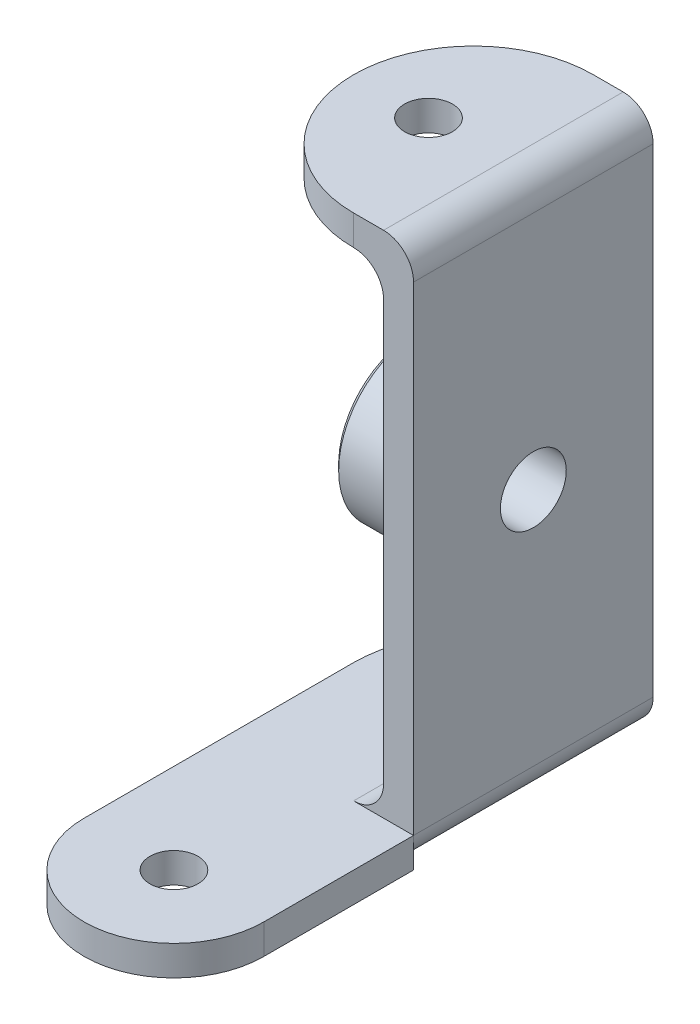
ISO-10303-21;
HEADER;
FILE_DESCRIPTION(('STEP AP214'),'2;1');
FILE_NAME('part.step','',(''),(''),'','','');
FILE_SCHEMA(('AUTOMOTIVE_DESIGN { 1 0 10303 214 1 1 1 1 }'));
ENDSEC;
DATA;
#1=APPLICATION_CONTEXT('core data for automotive mechanical design processes');
#2=APPLICATION_PROTOCOL_DEFINITION('international standard','automotive_design',2000,#1);
#3=PRODUCT_CONTEXT('',#1,'mechanical');
#4=PRODUCT('Part','Part','',(#3));
#5=PRODUCT_RELATED_PRODUCT_CATEGORY('part','',(#4));
#6=PRODUCT_DEFINITION_FORMATION('','',#4);
#7=PRODUCT_DEFINITION_CONTEXT('part definition',#1,'design');
#8=PRODUCT_DEFINITION('design','',#6,#7);
#9=PRODUCT_DEFINITION_SHAPE('','',#8);
#10=(LENGTH_UNIT() NAMED_UNIT(*) SI_UNIT(.MILLI.,.METRE.));
#11=(NAMED_UNIT(*) PLANE_ANGLE_UNIT() SI_UNIT($,.RADIAN.));
#12=(NAMED_UNIT(*) SI_UNIT($,.STERADIAN.) SOLID_ANGLE_UNIT());
#13=UNCERTAINTY_MEASURE_WITH_UNIT(LENGTH_MEASURE(1.E-05),#10,'distance_accuracy_value','');
#14=(GEOMETRIC_REPRESENTATION_CONTEXT(3) GLOBAL_UNCERTAINTY_ASSIGNED_CONTEXT((#13)) GLOBAL_UNIT_ASSIGNED_CONTEXT((#10,
#11,#12)) REPRESENTATION_CONTEXT('',''));
#15=CARTESIAN_POINT('',(0.,0.,0.));
#16=DIRECTION('',(0.,0.,1.));
#17=DIRECTION('',(1.,0.,0.));
#18=AXIS2_PLACEMENT_3D('',#15,#16,#17);
#19=CARTESIAN_POINT('',(30.,0.,0.));
#20=DIRECTION('',(-1.,0.,0.));
#21=DIRECTION('',(0.,-1.,0.));
#22=AXIS2_PLACEMENT_3D('',#19,#20,#21);
#23=CYLINDRICAL_SURFACE('',#22,5.5);
#24=CARTESIAN_POINT('',(30.,0.,0.));
#25=DIRECTION('',(-1.,0.,0.));
#26=DIRECTION('',(0.,-1.,0.));
#27=AXIS2_PLACEMENT_3D('',#24,#25,#26);
#28=CIRCLE('',#27,5.5);
#29=CARTESIAN_POINT('',(30.,-5.5,0.));
#30=VERTEX_POINT('',#29);
#31=EDGE_CURVE('E200',#30,#30,#28,.T.);
#32=ORIENTED_EDGE('',*,*,#31,.F.);
#33=EDGE_LOOP('',(#32));
#34=FACE_BOUND('',#33,.T.);
#35=CARTESIAN_POINT('',(15.,0.,0.));
#36=DIRECTION('',(-1.,0.,0.));
#37=DIRECTION('',(0.,-1.,0.));
#38=AXIS2_PLACEMENT_3D('',#35,#36,#37);
#39=CIRCLE('',#38,5.5);
#40=CARTESIAN_POINT('',(15.,-5.5,0.));
#41=VERTEX_POINT('',#40);
#42=EDGE_CURVE('E50',#41,#41,#39,.F.);
#43=ORIENTED_EDGE('',*,*,#42,.F.);
#44=EDGE_LOOP('',(#43));
#45=FACE_BOUND('',#44,.T.);
#46=ADVANCED_FACE('F45',(#34,#45),#23,.F.);
#47=CARTESIAN_POINT('',(15.,-40.,45.));
#48=DIRECTION('',(0.,1.,0.));
#49=DIRECTION('',(0.,0.,1.));
#50=AXIS2_PLACEMENT_3D('',#47,#48,#49);
#51=CYLINDRICAL_SURFACE('',#50,15.);
#52=DIRECTION('',(0.,-1.,0.));
#53=VECTOR('',#52,1.);
#54=CARTESIAN_POINT('',(30.,-40.,45.));
#55=LINE('',#54,#53);
#56=CARTESIAN_POINT('',(30.,-40.,45.));
#57=VERTEX_POINT('',#56);
#58=CARTESIAN_POINT('',(30.,-45.,45.));
#59=VERTEX_POINT('',#58);
#60=EDGE_CURVE('E147',#57,#59,#55,.T.);
#61=ORIENTED_EDGE('',*,*,#60,.F.);
#62=CARTESIAN_POINT('',(15.,-40.,45.));
#63=DIRECTION('',(0.,-1.,0.));
#64=DIRECTION('',(1.,0.,0.));
#65=AXIS2_PLACEMENT_3D('',#62,#63,#64);
#66=CIRCLE('',#65,15.);
#67=CARTESIAN_POINT('',(0.,-40.,45.));
#68=VERTEX_POINT('',#67);
#69=EDGE_CURVE('E56',#68,#57,#66,.F.);
#70=ORIENTED_EDGE('',*,*,#69,.F.);
#71=DIRECTION('',(0.,1.,0.));
#72=VECTOR('',#71,1.);
#73=CARTESIAN_POINT('',(0.,-40.,45.));
#74=LINE('',#73,#72);
#75=CARTESIAN_POINT('',(0.,-45.,45.));
#76=VERTEX_POINT('',#75);
#77=EDGE_CURVE('E328',#76,#68,#74,.T.);
#78=ORIENTED_EDGE('',*,*,#77,.F.);
#79=CARTESIAN_POINT('',(15.,-45.,45.));
#80=DIRECTION('',(0.,1.,0.));
#81=DIRECTION('',(0.,0.,1.));
#82=AXIS2_PLACEMENT_3D('',#79,#80,#81);
#83=CIRCLE('',#82,15.);
#84=EDGE_CURVE('E11',#59,#76,#83,.F.);
#85=ORIENTED_EDGE('',*,*,#84,.F.);
#86=EDGE_LOOP('',(#61,#70,#78,#85));
#87=FACE_BOUND('',#86,.T.);
#88=ADVANCED_FACE('F48',(#87),#51,.T.);
#89=CARTESIAN_POINT('',(20.,-45.,0.));
#90=DIRECTION('',(0.,-1.,0.));
#91=DIRECTION('',(1.,0.,0.));
#92=AXIS2_PLACEMENT_3D('',#89,#90,#91);
#93=CYLINDRICAL_SURFACE('',#92,20.);
#94=CARTESIAN_POINT('',(20.,-45.,0.));
#95=DIRECTION('',(0.,1.,0.));
#96=DIRECTION('',(0.,0.,1.));
#97=AXIS2_PLACEMENT_3D('',#94,#95,#96);
#98=CIRCLE('',#97,20.);
#99=CARTESIAN_POINT('',(0.,-45.,0.));
#100=VERTEX_POINT('',#99);
#101=CARTESIAN_POINT('',(20.,-45.,-20.));
#102=VERTEX_POINT('',#101);
#103=EDGE_CURVE('E312',#100,#102,#98,.F.);
#104=ORIENTED_EDGE('',*,*,#103,.F.);
#105=DIRECTION('',(0.,-1.,0.));
#106=VECTOR('',#105,1.);
#107=CARTESIAN_POINT('',(0.,-45.,0.));
#108=LINE('',#107,#106);
#109=CARTESIAN_POINT('',(0.,-40.,0.));
#110=VERTEX_POINT('',#109);
#111=EDGE_CURVE('E176',#110,#100,#108,.T.);
#112=ORIENTED_EDGE('',*,*,#111,.F.);
#113=CARTESIAN_POINT('',(20.,-40.,0.));
#114=DIRECTION('',(0.,-1.,0.));
#115=DIRECTION('',(1.,0.,0.));
#116=AXIS2_PLACEMENT_3D('',#113,#114,#115);
#117=CIRCLE('',#116,20.);
#118=CARTESIAN_POINT('',(20.,-40.,-20.));
#119=VERTEX_POINT('',#118);
#120=EDGE_CURVE('E315',#119,#110,#117,.F.);
#121=ORIENTED_EDGE('',*,*,#120,.F.);
#122=DIRECTION('',(0.,1.,0.));
#123=VECTOR('',#122,1.);
#124=CARTESIAN_POINT('',(20.,-45.,-20.));
#125=LINE('',#124,#123);
#126=EDGE_CURVE('E308',#102,#119,#125,.T.);
#127=ORIENTED_EDGE('',*,*,#126,.F.);
#128=EDGE_LOOP('',(#104,#112,#121,#127));
#129=FACE_BOUND('',#128,.T.);
#130=ADVANCED_FACE('F342',(#129),#93,.T.);
#131=CARTESIAN_POINT('',(20.,45.,0.));
#132=DIRECTION('',(0.,-1.,0.));
#133=DIRECTION('',(1.,0.,0.));
#134=AXIS2_PLACEMENT_3D('',#131,#132,#133);
#135=CYLINDRICAL_SURFACE('',#134,20.);
#136=DIRECTION('',(0.,-1.,0.));
#137=VECTOR('',#136,1.);
#138=CARTESIAN_POINT('',(20.,35.,20.));
#139=LINE('',#138,#137);
#140=CARTESIAN_POINT('',(20.,45.,20.));
#141=VERTEX_POINT('',#140);
#142=CARTESIAN_POINT('',(20.,40.,20.));
#143=VERTEX_POINT('',#142);
#144=EDGE_CURVE('E294',#141,#143,#139,.T.);
#145=ORIENTED_EDGE('',*,*,#144,.F.);
#146=CARTESIAN_POINT('',(20.,45.,0.));
#147=DIRECTION('',(0.,-1.,0.));
#148=DIRECTION('',(0.,0.,-1.));
#149=AXIS2_PLACEMENT_3D('',#146,#147,#148);
#150=CIRCLE('',#149,20.);
#151=CARTESIAN_POINT('',(20.,45.,-20.));
#152=VERTEX_POINT('',#151);
#153=EDGE_CURVE('E302',#152,#141,#150,.F.);
#154=ORIENTED_EDGE('',*,*,#153,.F.);
#155=DIRECTION('',(0.,1.,0.));
#156=VECTOR('',#155,1.);
#157=CARTESIAN_POINT('',(20.,45.,-20.));
#158=LINE('',#157,#156);
#159=CARTESIAN_POINT('',(20.,40.,-20.));
#160=VERTEX_POINT('',#159);
#161=EDGE_CURVE('E298',#160,#152,#158,.T.);
#162=ORIENTED_EDGE('',*,*,#161,.F.);
#163=CARTESIAN_POINT('',(20.,40.,0.));
#164=DIRECTION('',(0.,1.,0.));
#165=DIRECTION('',(0.,0.,1.));
#166=AXIS2_PLACEMENT_3D('',#163,#164,#165);
#167=CIRCLE('',#166,20.);
#168=EDGE_CURVE('E305',#143,#160,#167,.F.);
#169=ORIENTED_EDGE('',*,*,#168,.F.);
#170=EDGE_LOOP('',(#145,#154,#162,#169));
#171=FACE_BOUND('',#170,.T.);
#172=ADVANCED_FACE('F380',(#171),#135,.T.);
#173=CARTESIAN_POINT('',(0.,40.,20.));
#174=DIRECTION('',(0.,1.,0.));
#175=DIRECTION('',(0.,0.,1.));
#176=AXIS2_PLACEMENT_3D('',#173,#174,#175);
#177=PLANE('',#176);
#178=CARTESIAN_POINT('',(12.5,40.,0.));
#179=DIRECTION('',(0.,1.,0.));
#180=DIRECTION('',(0.,0.,1.));
#181=AXIS2_PLACEMENT_3D('',#178,#179,#180);
#182=CIRCLE('',#181,4.);
#183=CARTESIAN_POINT('',(12.5,40.,4.));
#184=VERTEX_POINT('',#183);
#185=EDGE_CURVE('E196',#184,#184,#182,.T.);
#186=ORIENTED_EDGE('',*,*,#185,.T.);
#187=EDGE_LOOP('',(#186));
#188=FACE_BOUND('',#187,.T.);
#189=DIRECTION('',(0.,0.,-1.));
#190=VECTOR('',#189,1.);
#191=CARTESIAN_POINT('',(20.,40.,20.));
#192=LINE('',#191,#190);
#193=EDGE_CURVE('E278',#143,#160,#192,.T.);
#194=ORIENTED_EDGE('',*,*,#193,.F.);
#195=ORIENTED_EDGE('',*,*,#168,.T.);
#196=EDGE_LOOP('',(#194,#195));
#197=FACE_BOUND('',#196,.T.);
#198=ADVANCED_FACE('F376',(#188,#197),#177,.F.);
#199=CARTESIAN_POINT('',(20.,35.,20.));
#200=DIRECTION('',(0.,0.,-1.));
#201=DIRECTION('',(-1.,0.,0.));
#202=AXIS2_PLACEMENT_3D('',#199,#200,#201);
#203=CYLINDRICAL_SURFACE('',#202,5.);
#204=CARTESIAN_POINT('',(20.,35.,-20.));
#205=DIRECTION('',(0.,0.,-1.));
#206=DIRECTION('',(-1.,0.,0.));
#207=AXIS2_PLACEMENT_3D('',#204,#205,#206);
#208=CIRCLE('',#207,5.);
#209=CARTESIAN_POINT('',(25.,35.,-20.));
#210=VERTEX_POINT('',#209);
#211=EDGE_CURVE('E204',#160,#210,#208,.T.);
#212=ORIENTED_EDGE('',*,*,#211,.T.);
#213=DIRECTION('',(0.,0.,-1.));
#214=VECTOR('',#213,1.);
#215=CARTESIAN_POINT('',(25.,35.,20.));
#216=LINE('',#215,#214);
#217=CARTESIAN_POINT('',(25.,35.,20.));
#218=VERTEX_POINT('',#217);
#219=EDGE_CURVE('E274',#218,#210,#216,.T.);
#220=ORIENTED_EDGE('',*,*,#219,.F.);
#221=CARTESIAN_POINT('',(20.,35.,20.));
#222=DIRECTION('',(0.,0.,-1.));
#223=DIRECTION('',(-1.,0.,0.));
#224=AXIS2_PLACEMENT_3D('',#221,#222,#223);
#225=CIRCLE('',#224,5.);
#226=EDGE_CURVE('E205',#143,#218,#225,.T.);
#227=ORIENTED_EDGE('',*,*,#226,.F.);
#228=ORIENTED_EDGE('',*,*,#193,.T.);
#229=EDGE_LOOP('',(#212,#220,#227,#228));
#230=FACE_BOUND('',#229,.T.);
#231=ADVANCED_FACE('F373',(#230),#203,.F.);
#232=CARTESIAN_POINT('',(25.,35.,20.));
#233=DIRECTION('',(1.,0.,0.));
#234=DIRECTION('',(0.,0.,-1.));
#235=AXIS2_PLACEMENT_3D('',#232,#233,#234);
#236=PLANE('',#235);
#237=CARTESIAN_POINT('',(25.,0.,0.));
#238=DIRECTION('',(1.,0.,0.));
#239=DIRECTION('',(0.,0.,-1.));
#240=AXIS2_PLACEMENT_3D('',#237,#238,#239);
#241=CIRCLE('',#240,13.5);
#242=CARTESIAN_POINT('',(25.,0.,-13.5));
#243=VERTEX_POINT('',#242);
#244=EDGE_CURVE('E282',#243,#243,#241,.F.);
#245=ORIENTED_EDGE('',*,*,#244,.F.);
#246=EDGE_LOOP('',(#245));
#247=FACE_BOUND('',#246,.T.);
#248=DIRECTION('',(0.,-1.,0.));
#249=VECTOR('',#248,1.);
#250=CARTESIAN_POINT('',(25.,35.,-20.));
#251=LINE('',#250,#249);
#252=CARTESIAN_POINT('',(25.,-35.,-20.));
#253=VERTEX_POINT('',#252);
#254=EDGE_CURVE('E231',#210,#253,#251,.T.);
#255=ORIENTED_EDGE('',*,*,#254,.T.);
#256=DIRECTION('',(0.,0.,-1.));
#257=VECTOR('',#256,1.);
#258=CARTESIAN_POINT('',(25.,-35.,20.));
#259=LINE('',#258,#257);
#260=CARTESIAN_POINT('',(25.,-35.,20.));
#261=VERTEX_POINT('',#260);
#262=EDGE_CURVE('E270',#261,#253,#259,.T.);
#263=ORIENTED_EDGE('',*,*,#262,.F.);
#264=DIRECTION('',(0.,-1.,0.));
#265=VECTOR('',#264,1.);
#266=CARTESIAN_POINT('',(25.,35.,20.));
#267=LINE('',#266,#265);
#268=EDGE_CURVE('E208',#218,#261,#267,.T.);
#269=ORIENTED_EDGE('',*,*,#268,.F.);
#270=ORIENTED_EDGE('',*,*,#219,.T.);
#271=EDGE_LOOP('',(#255,#263,#269,#270));
#272=FACE_BOUND('',#271,.T.);
#273=ADVANCED_FACE('F368',(#247,#272),#236,.F.);
#274=CARTESIAN_POINT('',(20.,-35.,20.));
#275=DIRECTION('',(0.,0.,-1.));
#276=DIRECTION('',(-1.,0.,0.));
#277=AXIS2_PLACEMENT_3D('',#274,#275,#276);
#278=CYLINDRICAL_SURFACE('',#277,5.);
#279=CARTESIAN_POINT('',(20.,-35.,-20.));
#280=DIRECTION('',(0.,0.,-1.));
#281=DIRECTION('',(-1.,0.,0.));
#282=AXIS2_PLACEMENT_3D('',#279,#280,#281);
#283=CIRCLE('',#282,5.);
#284=EDGE_CURVE('E234',#253,#119,#283,.T.);
#285=ORIENTED_EDGE('',*,*,#284,.T.);
#286=DIRECTION('',(0.,0.,-1.));
#287=VECTOR('',#286,1.);
#288=CARTESIAN_POINT('',(20.,-40.,20.));
#289=LINE('',#288,#287);
#290=CARTESIAN_POINT('',(20.,-40.,20.));
#291=VERTEX_POINT('',#290);
#292=EDGE_CURVE('E266',#291,#119,#289,.T.);
#293=ORIENTED_EDGE('',*,*,#292,.F.);
#294=CARTESIAN_POINT('',(20.,-35.,20.));
#295=DIRECTION('',(0.,0.,-1.));
#296=DIRECTION('',(-1.,0.,0.));
#297=AXIS2_PLACEMENT_3D('',#294,#295,#296);
#298=CIRCLE('',#297,5.);
#299=EDGE_CURVE('E212',#261,#291,#298,.T.);
#300=ORIENTED_EDGE('',*,*,#299,.F.);
#301=ORIENTED_EDGE('',*,*,#262,.T.);
#302=EDGE_LOOP('',(#285,#293,#300,#301));
#303=FACE_BOUND('',#302,.T.);
#304=ADVANCED_FACE('F363',(#303),#278,.F.);
#305=CARTESIAN_POINT('',(20.,-40.,20.));
#306=DIRECTION('',(0.,-1.,0.));
#307=DIRECTION('',(1.,0.,0.));
#308=AXIS2_PLACEMENT_3D('',#305,#306,#307);
#309=PLANE('',#308);
#310=CARTESIAN_POINT('',(15.,-40.,45.));
#311=DIRECTION('',(0.,1.,0.));
#312=DIRECTION('',(-1.,0.,0.));
#313=AXIS2_PLACEMENT_3D('',#310,#311,#312);
#314=CIRCLE('',#313,3.99999999999999);
#315=CARTESIAN_POINT('',(11.,-40.,45.));
#316=VERTEX_POINT('',#315);
#317=EDGE_CURVE('E325',#316,#316,#314,.T.);
#318=ORIENTED_EDGE('',*,*,#317,.F.);
#319=EDGE_LOOP('',(#318));
#320=FACE_BOUND('',#319,.T.);
#321=CARTESIAN_POINT('',(12.5,-40.,0.));
#322=DIRECTION('',(0.,1.,0.));
#323=DIRECTION('',(-1.,0.,0.));
#324=AXIS2_PLACEMENT_3D('',#321,#322,#323);
#325=CIRCLE('',#324,4.00000000000001);
#326=CARTESIAN_POINT('',(8.50000000000001,-40.,0.));
#327=VERTEX_POINT('',#326);
#328=EDGE_CURVE('E180',#327,#327,#325,.T.);
#329=ORIENTED_EDGE('',*,*,#328,.F.);
#330=EDGE_LOOP('',(#329));
#331=FACE_BOUND('',#330,.T.);
#332=DIRECTION('',(0.,0.,1.));
#333=VECTOR('',#332,1.);
#334=CARTESIAN_POINT('',(0.,-40.,-20.001));
#335=LINE('',#334,#333);
#336=EDGE_CURVE('E149',#110,#68,#335,.T.);
#337=ORIENTED_EDGE('',*,*,#336,.T.);
#338=ORIENTED_EDGE('',*,*,#69,.T.);
#339=DIRECTION('',(0.,0.,-1.));
#340=VECTOR('',#339,1.);
#341=CARTESIAN_POINT('',(30.,-40.,60.));
#342=LINE('',#341,#340);
#343=CARTESIAN_POINT('',(30.,-40.,20.));
#344=VERTEX_POINT('',#343);
#345=EDGE_CURVE('E150',#57,#344,#342,.T.);
#346=ORIENTED_EDGE('',*,*,#345,.T.);
#347=DIRECTION('',(-1.,0.,0.));
#348=VECTOR('',#347,1.);
#349=CARTESIAN_POINT('',(20.,-40.,20.));
#350=LINE('',#349,#348);
#351=EDGE_CURVE('E167',#344,#291,#350,.T.);
#352=ORIENTED_EDGE('',*,*,#351,.T.);
#353=ORIENTED_EDGE('',*,*,#292,.T.);
#354=ORIENTED_EDGE('',*,*,#120,.T.);
#355=EDGE_LOOP('',(#337,#338,#346,#352,#353,#354));
#356=FACE_BOUND('',#355,.T.);
#357=ADVANCED_FACE('F334',(#320,#331,#356),#309,.F.);
#358=CARTESIAN_POINT('',(25.,-45.,20.));
#359=DIRECTION('',(0.,1.,0.));
#360=DIRECTION('',(0.,0.,1.));
#361=AXIS2_PLACEMENT_3D('',#358,#359,#360);
#362=PLANE('',#361);
#363=CARTESIAN_POINT('',(15.,-45.,45.));
#364=DIRECTION('',(0.,1.,0.));
#365=DIRECTION('',(0.,0.,1.));
#366=AXIS2_PLACEMENT_3D('',#363,#364,#365);
#367=CIRCLE('',#366,3.99999999999999);
#368=CARTESIAN_POINT('',(15.,-45.,49.));
#369=VERTEX_POINT('',#368);
#370=EDGE_CURVE('E161',#369,#369,#367,.T.);
#371=ORIENTED_EDGE('',*,*,#370,.T.);
#372=EDGE_LOOP('',(#371));
#373=FACE_BOUND('',#372,.T.);
#374=DIRECTION('',(0.,0.,-1.));
#375=VECTOR('',#374,1.);
#376=CARTESIAN_POINT('',(30.,-45.,60.));
#377=LINE('',#376,#375);
#378=CARTESIAN_POINT('',(30.,-45.,20.));
#379=VERTEX_POINT('',#378);
#380=EDGE_CURVE('E140',#59,#379,#377,.T.);
#381=ORIENTED_EDGE('',*,*,#380,.F.);
#382=ORIENTED_EDGE('',*,*,#84,.T.);
#383=DIRECTION('',(0.,0.,1.));
#384=VECTOR('',#383,1.);
#385=CARTESIAN_POINT('',(0.,-45.,-20.001));
#386=LINE('',#385,#384);
#387=EDGE_CURVE('E181',#100,#76,#386,.T.);
#388=ORIENTED_EDGE('',*,*,#387,.F.);
#389=ORIENTED_EDGE('',*,*,#103,.T.);
#390=DIRECTION('',(1.,0.,0.));
#391=VECTOR('',#390,1.);
#392=CARTESIAN_POINT('',(25.,-45.,-20.));
#393=LINE('',#392,#391);
#394=CARTESIAN_POINT('',(25.,-45.,-20.));
#395=VERTEX_POINT('',#394);
#396=EDGE_CURVE('E238',#102,#395,#393,.T.);
#397=ORIENTED_EDGE('',*,*,#396,.T.);
#398=DIRECTION('',(0.,0.,-1.));
#399=VECTOR('',#398,1.);
#400=CARTESIAN_POINT('',(25.,-45.,20.));
#401=LINE('',#400,#399);
#402=CARTESIAN_POINT('',(25.,-45.,20.));
#403=VERTEX_POINT('',#402);
#404=EDGE_CURVE('E157',#403,#395,#401,.T.);
#405=ORIENTED_EDGE('',*,*,#404,.F.);
#406=DIRECTION('',(1.,0.,0.));
#407=VECTOR('',#406,1.);
#408=CARTESIAN_POINT('',(0.,-45.,20.));
#409=LINE('',#408,#407);
#410=EDGE_CURVE('E153',#403,#379,#409,.T.);
#411=ORIENTED_EDGE('',*,*,#410,.T.);
#412=EDGE_LOOP('',(#381,#382,#388,#389,#397,#405,#411));
#413=FACE_BOUND('',#412,.T.);
#414=CARTESIAN_POINT('',(12.5,-45.,0.));
#415=DIRECTION('',(0.,1.,0.));
#416=DIRECTION('',(0.,0.,1.));
#417=AXIS2_PLACEMENT_3D('',#414,#415,#416);
#418=CIRCLE('',#417,4.00000000000001);
#419=CARTESIAN_POINT('',(12.5,-45.,4.00000000000001));
#420=VERTEX_POINT('',#419);
#421=EDGE_CURVE('E191',#420,#420,#418,.T.);
#422=ORIENTED_EDGE('',*,*,#421,.T.);
#423=EDGE_LOOP('',(#422));
#424=FACE_BOUND('',#423,.T.);
#425=ADVANCED_FACE('F154',(#373,#413,#424),#362,.F.);
#426=CARTESIAN_POINT('',(25.,-40.,20.));
#427=DIRECTION('',(0.,0.,-1.));
#428=DIRECTION('',(-1.,0.,0.));
#429=AXIS2_PLACEMENT_3D('',#426,#427,#428);
#430=CYLINDRICAL_SURFACE('',#429,5.);
#431=CARTESIAN_POINT('',(25.,-40.,-20.));
#432=DIRECTION('',(0.,0.,1.));
#433=DIRECTION('',(-1.,0.,0.));
#434=AXIS2_PLACEMENT_3D('',#431,#432,#433);
#435=CIRCLE('',#434,5.);
#436=CARTESIAN_POINT('',(30.,-40.,-20.));
#437=VERTEX_POINT('',#436);
#438=EDGE_CURVE('E241',#395,#437,#435,.T.);
#439=ORIENTED_EDGE('',*,*,#438,.T.);
#440=DIRECTION('',(0.,0.,-1.));
#441=VECTOR('',#440,1.);
#442=CARTESIAN_POINT('',(30.,-40.,20.));
#443=LINE('',#442,#441);
#444=EDGE_CURVE('E260',#344,#437,#443,.T.);
#445=ORIENTED_EDGE('',*,*,#444,.F.);
#446=CARTESIAN_POINT('',(25.,-40.,20.));
#447=DIRECTION('',(0.,0.,1.));
#448=DIRECTION('',(-1.,0.,0.));
#449=AXIS2_PLACEMENT_3D('',#446,#447,#448);
#450=CIRCLE('',#449,5.);
#451=EDGE_CURVE('E164',#403,#344,#450,.T.);
#452=ORIENTED_EDGE('',*,*,#451,.F.);
#453=ORIENTED_EDGE('',*,*,#404,.T.);
#454=EDGE_LOOP('',(#439,#445,#452,#453));
#455=FACE_BOUND('',#454,.T.);
#456=ADVANCED_FACE('F351',(#455),#430,.T.);
#457=CARTESIAN_POINT('',(30.,40.,20.));
#458=DIRECTION('',(-1.,0.,0.));
#459=DIRECTION('',(0.,0.,1.));
#460=AXIS2_PLACEMENT_3D('',#457,#458,#459);
#461=PLANE('',#460);
#462=ORIENTED_EDGE('',*,*,#31,.T.);
#463=EDGE_LOOP('',(#462));
#464=FACE_BOUND('',#463,.T.);
#465=DIRECTION('',(0.,1.,0.));
#466=VECTOR('',#465,1.);
#467=CARTESIAN_POINT('',(30.,40.,-20.));
#468=LINE('',#467,#466);
#469=CARTESIAN_POINT('',(30.,40.,-20.));
#470=VERTEX_POINT('',#469);
#471=EDGE_CURVE('E244',#437,#470,#468,.T.);
#472=ORIENTED_EDGE('',*,*,#471,.T.);
#473=DIRECTION('',(0.,0.,-1.));
#474=VECTOR('',#473,1.);
#475=CARTESIAN_POINT('',(30.,40.,20.));
#476=LINE('',#475,#474);
#477=CARTESIAN_POINT('',(30.,40.,20.));
#478=VERTEX_POINT('',#477);
#479=EDGE_CURVE('E256',#478,#470,#476,.T.);
#480=ORIENTED_EDGE('',*,*,#479,.F.);
#481=DIRECTION('',(0.,1.,0.));
#482=VECTOR('',#481,1.);
#483=CARTESIAN_POINT('',(30.,40.,20.));
#484=LINE('',#483,#482);
#485=EDGE_CURVE('E218',#344,#478,#484,.T.);
#486=ORIENTED_EDGE('',*,*,#485,.F.);
#487=ORIENTED_EDGE('',*,*,#444,.T.);
#488=EDGE_LOOP('',(#472,#480,#486,#487));
#489=FACE_BOUND('',#488,.T.);
#490=ADVANCED_FACE('F354',(#464,#489),#461,.F.);
#491=CARTESIAN_POINT('',(25.,40.,20.));
#492=DIRECTION('',(0.,0.,-1.));
#493=DIRECTION('',(-1.,0.,0.));
#494=AXIS2_PLACEMENT_3D('',#491,#492,#493);
#495=CYLINDRICAL_SURFACE('',#494,5.);
#496=CARTESIAN_POINT('',(25.,40.,-20.));
#497=DIRECTION('',(0.,0.,1.));
#498=DIRECTION('',(-1.,0.,0.));
#499=AXIS2_PLACEMENT_3D('',#496,#497,#498);
#500=CIRCLE('',#499,5.);
#501=CARTESIAN_POINT('',(25.,45.,-20.));
#502=VERTEX_POINT('',#501);
#503=EDGE_CURVE('E247',#470,#502,#500,.T.);
#504=ORIENTED_EDGE('',*,*,#503,.T.);
#505=DIRECTION('',(0.,0.,-1.));
#506=VECTOR('',#505,1.);
#507=CARTESIAN_POINT('',(25.,45.,20.));
#508=LINE('',#507,#506);
#509=CARTESIAN_POINT('',(25.,45.,20.));
#510=VERTEX_POINT('',#509);
#511=EDGE_CURVE('E228',#510,#502,#508,.T.);
#512=ORIENTED_EDGE('',*,*,#511,.F.);
#513=CARTESIAN_POINT('',(25.,40.,20.));
#514=DIRECTION('',(0.,0.,1.));
#515=DIRECTION('',(-1.,0.,0.));
#516=AXIS2_PLACEMENT_3D('',#513,#514,#515);
#517=CIRCLE('',#516,5.);
#518=EDGE_CURVE('E221',#478,#510,#517,.T.);
#519=ORIENTED_EDGE('',*,*,#518,.F.);
#520=ORIENTED_EDGE('',*,*,#479,.T.);
#521=EDGE_LOOP('',(#504,#512,#519,#520));
#522=FACE_BOUND('',#521,.T.);
#523=ADVANCED_FACE('F386',(#522),#495,.T.);
#524=CARTESIAN_POINT('',(0.,45.,20.));
#525=DIRECTION('',(0.,-1.,0.));
#526=DIRECTION('',(0.,0.,-1.));
#527=AXIS2_PLACEMENT_3D('',#524,#525,#526);
#528=PLANE('',#527);
#529=CARTESIAN_POINT('',(12.5,45.,0.));
#530=DIRECTION('',(0.,1.,0.));
#531=DIRECTION('',(-1.,0.,0.));
#532=AXIS2_PLACEMENT_3D('',#529,#530,#531);
#533=CIRCLE('',#532,4.);
#534=CARTESIAN_POINT('',(8.49999999999999,45.,0.));
#535=VERTEX_POINT('',#534);
#536=EDGE_CURVE('E192',#535,#535,#533,.T.);
#537=ORIENTED_EDGE('',*,*,#536,.F.);
#538=EDGE_LOOP('',(#537));
#539=FACE_BOUND('',#538,.T.);
#540=DIRECTION('',(-1.,0.,0.));
#541=VECTOR('',#540,1.);
#542=CARTESIAN_POINT('',(0.,45.,-20.));
#543=LINE('',#542,#541);
#544=EDGE_CURVE('E209',#502,#152,#543,.T.);
#545=ORIENTED_EDGE('',*,*,#544,.T.);
#546=ORIENTED_EDGE('',*,*,#153,.T.);
#547=DIRECTION('',(-1.,0.,0.));
#548=VECTOR('',#547,1.);
#549=CARTESIAN_POINT('',(0.,45.,20.));
#550=LINE('',#549,#548);
#551=EDGE_CURVE('E224',#510,#141,#550,.T.);
#552=ORIENTED_EDGE('',*,*,#551,.F.);
#553=ORIENTED_EDGE('',*,*,#511,.T.);
#554=EDGE_LOOP('',(#545,#546,#552,#553));
#555=FACE_BOUND('',#554,.T.);
#556=ADVANCED_FACE('F383',(#539,#555),#528,.F.);
#557=CARTESIAN_POINT('',(20.,35.,20.));
#558=DIRECTION('',(0.,0.,-1.));
#559=DIRECTION('',(-1.,0.,0.));
#560=AXIS2_PLACEMENT_3D('',#557,#558,#559);
#561=PLANE('',#560);
#562=ORIENTED_EDGE('',*,*,#299,.T.);
#563=ORIENTED_EDGE('',*,*,#351,.F.);
#564=ORIENTED_EDGE('',*,*,#485,.T.);
#565=ORIENTED_EDGE('',*,*,#518,.T.);
#566=ORIENTED_EDGE('',*,*,#551,.T.);
#567=ORIENTED_EDGE('',*,*,#144,.T.);
#568=ORIENTED_EDGE('',*,*,#226,.T.);
#569=ORIENTED_EDGE('',*,*,#268,.T.);
#570=EDGE_LOOP('',(#562,#563,#564,#565,#566,#567,#568,#569));
#571=FACE_BOUND('',#570,.T.);
#572=ADVANCED_FACE('F358',(#571),#561,.F.);
#573=CARTESIAN_POINT('',(20.,35.,-20.));
#574=DIRECTION('',(0.,0.,-1.));
#575=DIRECTION('',(-1.,0.,0.));
#576=AXIS2_PLACEMENT_3D('',#573,#574,#575);
#577=PLANE('',#576);
#578=ORIENTED_EDGE('',*,*,#396,.F.);
#579=ORIENTED_EDGE('',*,*,#126,.T.);
#580=ORIENTED_EDGE('',*,*,#284,.F.);
#581=ORIENTED_EDGE('',*,*,#254,.F.);
#582=ORIENTED_EDGE('',*,*,#211,.F.);
#583=ORIENTED_EDGE('',*,*,#161,.T.);
#584=ORIENTED_EDGE('',*,*,#544,.F.);
#585=ORIENTED_EDGE('',*,*,#503,.F.);
#586=ORIENTED_EDGE('',*,*,#471,.F.);
#587=ORIENTED_EDGE('',*,*,#438,.F.);
#588=EDGE_LOOP('',(#578,#579,#580,#581,#582,#583,#584,#585,#586,#587));
#589=FACE_BOUND('',#588,.T.);
#590=ADVANCED_FACE('F346',(#589),#577,.T.);
#591=CARTESIAN_POINT('',(9.99999999999999,0.,0.));
#592=DIRECTION('',(1.,0.,0.));
#593=DIRECTION('',(0.,1.,0.));
#594=AXIS2_PLACEMENT_3D('',#591,#592,#593);
#595=CYLINDRICAL_SURFACE('',#594,13.5);
#596=CARTESIAN_POINT('',(11.,0.,0.));
#597=DIRECTION('',(-1.,0.,0.));
#598=DIRECTION('',(0.,-1.,0.));
#599=AXIS2_PLACEMENT_3D('',#596,#597,#598);
#600=CIRCLE('',#599,13.5);
#601=CARTESIAN_POINT('',(11.,-13.5,0.));
#602=VERTEX_POINT('',#601);
#603=EDGE_CURVE('E290',#602,#602,#600,.F.);
#604=ORIENTED_EDGE('',*,*,#603,.T.);
#605=EDGE_LOOP('',(#604));
#606=FACE_BOUND('',#605,.T.);
#607=ORIENTED_EDGE('',*,*,#244,.T.);
#608=EDGE_LOOP('',(#607));
#609=FACE_BOUND('',#608,.T.);
#610=ADVANCED_FACE('F413',(#606,#609),#595,.T.);
#611=CARTESIAN_POINT('',(9.99999999999999,0.,0.));
#612=DIRECTION('',(-1.,0.,0.));
#613=DIRECTION('',(0.,-1.,0.));
#614=AXIS2_PLACEMENT_3D('',#611,#612,#613);
#615=PLANE('',#614);
#616=CARTESIAN_POINT('',(9.99999999999999,0.,0.));
#617=DIRECTION('',(-1.,0.,0.));
#618=DIRECTION('',(0.,-1.,0.));
#619=AXIS2_PLACEMENT_3D('',#616,#617,#618);
#620=CIRCLE('',#619,10.);
#621=CARTESIAN_POINT('',(10.,-10.,0.));
#622=VERTEX_POINT('',#621);
#623=EDGE_CURVE('E659',#622,#622,#620,.T.);
#624=ORIENTED_EDGE('',*,*,#623,.F.);
#625=EDGE_LOOP('',(#624));
#626=FACE_BOUND('',#625,.T.);
#627=CARTESIAN_POINT('',(9.99999999999999,0.,0.));
#628=DIRECTION('',(-1.,0.,0.));
#629=DIRECTION('',(0.,-1.,0.));
#630=AXIS2_PLACEMENT_3D('',#627,#628,#629);
#631=CIRCLE('',#630,12.5);
#632=CARTESIAN_POINT('',(10.,-12.5,0.));
#633=VERTEX_POINT('',#632);
#634=EDGE_CURVE('E286',#633,#633,#631,.T.);
#635=ORIENTED_EDGE('',*,*,#634,.T.);
#636=EDGE_LOOP('',(#635));
#637=FACE_BOUND('',#636,.T.);
#638=ADVANCED_FACE('F409',(#626,#637),#615,.T.);
#639=CARTESIAN_POINT('',(9.99999999999999,0.,0.));
#640=DIRECTION('',(1.,0.,0.));
#641=DIRECTION('',(0.,1.,0.));
#642=AXIS2_PLACEMENT_3D('',#639,#640,#641);
#643=CONICAL_SURFACE('',#642,12.5,0.785398163397439);
#644=ORIENTED_EDGE('',*,*,#603,.F.);
#645=EDGE_LOOP('',(#644));
#646=FACE_BOUND('',#645,.T.);
#647=ORIENTED_EDGE('',*,*,#634,.F.);
#648=EDGE_LOOP('',(#647));
#649=FACE_BOUND('',#648,.T.);
#650=ADVANCED_FACE('F412',(#646,#649),#643,.T.);
#651=CARTESIAN_POINT('',(12.5,35.,0.));
#652=DIRECTION('',(0.,1.,0.));
#653=DIRECTION('',(-1.,0.,0.));
#654=AXIS2_PLACEMENT_3D('',#651,#652,#653);
#655=CYLINDRICAL_SURFACE('',#654,4.);
#656=ORIENTED_EDGE('',*,*,#536,.T.);
#657=EDGE_LOOP('',(#656));
#658=FACE_BOUND('',#657,.T.);
#659=ORIENTED_EDGE('',*,*,#185,.F.);
#660=EDGE_LOOP('',(#659));
#661=FACE_BOUND('',#660,.T.);
#662=ADVANCED_FACE('F407',(#658,#661),#655,.F.);
#663=CARTESIAN_POINT('',(12.5,-50.,0.));
#664=DIRECTION('',(0.,1.,0.));
#665=DIRECTION('',(-1.,0.,0.));
#666=AXIS2_PLACEMENT_3D('',#663,#664,#665);
#667=CYLINDRICAL_SURFACE('',#666,4.00000000000001);
#668=ORIENTED_EDGE('',*,*,#328,.T.);
#669=EDGE_LOOP('',(#668));
#670=FACE_BOUND('',#669,.T.);
#671=ORIENTED_EDGE('',*,*,#421,.F.);
#672=EDGE_LOOP('',(#671));
#673=FACE_BOUND('',#672,.T.);
#674=ADVANCED_FACE('F450',(#670,#673),#667,.F.);
#675=CARTESIAN_POINT('',(0.,-40.,-20.001));
#676=DIRECTION('',(-1.,0.,0.));
#677=DIRECTION('',(0.,0.,1.));
#678=AXIS2_PLACEMENT_3D('',#675,#676,#677);
#679=PLANE('',#678);
#680=ORIENTED_EDGE('',*,*,#387,.T.);
#681=ORIENTED_EDGE('',*,*,#77,.T.);
#682=ORIENTED_EDGE('',*,*,#336,.F.);
#683=ORIENTED_EDGE('',*,*,#111,.T.);
#684=EDGE_LOOP('',(#680,#681,#682,#683));
#685=FACE_BOUND('',#684,.T.);
#686=ADVANCED_FACE('F336',(#685),#679,.T.);
#687=CARTESIAN_POINT('',(0.,0.,20.));
#688=DIRECTION('',(0.,0.,1.));
#689=DIRECTION('',(1.,0.,0.));
#690=AXIS2_PLACEMENT_3D('',#687,#688,#689);
#691=PLANE('',#690);
#692=ORIENTED_EDGE('',*,*,#410,.F.);
#693=ORIENTED_EDGE('',*,*,#451,.T.);
#694=DIRECTION('',(0.,1.,0.));
#695=VECTOR('',#694,1.);
#696=CARTESIAN_POINT('',(30.,-40.,20.));
#697=LINE('',#696,#695);
#698=EDGE_CURVE('E145',#379,#344,#697,.T.);
#699=ORIENTED_EDGE('',*,*,#698,.F.);
#700=EDGE_LOOP('',(#692,#693,#699));
#701=FACE_BOUND('',#700,.T.);
#702=ADVANCED_FACE('F163',(#701),#691,.F.);
#703=CARTESIAN_POINT('',(30.,-40.,60.));
#704=DIRECTION('',(-1.,0.,0.));
#705=DIRECTION('',(0.,0.,1.));
#706=AXIS2_PLACEMENT_3D('',#703,#704,#705);
#707=PLANE('',#706);
#708=ORIENTED_EDGE('',*,*,#345,.F.);
#709=ORIENTED_EDGE('',*,*,#60,.T.);
#710=ORIENTED_EDGE('',*,*,#380,.T.);
#711=ORIENTED_EDGE('',*,*,#698,.T.);
#712=EDGE_LOOP('',(#708,#709,#710,#711));
#713=FACE_BOUND('',#712,.T.);
#714=ADVANCED_FACE('F143',(#713),#707,.F.);
#715=CARTESIAN_POINT('',(15.,-70.,45.));
#716=DIRECTION('',(0.,1.,0.));
#717=DIRECTION('',(-1.,0.,0.));
#718=AXIS2_PLACEMENT_3D('',#715,#716,#717);
#719=CYLINDRICAL_SURFACE('',#718,3.99999999999999);
#720=ORIENTED_EDGE('',*,*,#317,.T.);
#721=EDGE_LOOP('',(#720));
#722=FACE_BOUND('',#721,.T.);
#723=ORIENTED_EDGE('',*,*,#370,.F.);
#724=EDGE_LOOP('',(#723));
#725=FACE_BOUND('',#724,.T.);
#726=ADVANCED_FACE('F478',(#722,#725),#719,.F.);
#727=CARTESIAN_POINT('',(15.,0.,0.));
#728=DIRECTION('',(-1.,0.,0.));
#729=DIRECTION('',(0.,-1.,0.));
#730=AXIS2_PLACEMENT_3D('',#727,#728,#729);
#731=PLANE('',#730);
#732=CARTESIAN_POINT('',(15.,0.,0.));
#733=DIRECTION('',(-1.,0.,0.));
#734=DIRECTION('',(0.,-1.,0.));
#735=AXIS2_PLACEMENT_3D('',#732,#733,#734);
#736=CIRCLE('',#735,10.);
#737=CARTESIAN_POINT('',(15.,-10.,0.));
#738=VERTEX_POINT('',#737);
#739=EDGE_CURVE('E657',#738,#738,#736,.T.);
#740=ORIENTED_EDGE('',*,*,#739,.T.);
#741=EDGE_LOOP('',(#740));
#742=FACE_BOUND('',#741,.T.);
#743=ORIENTED_EDGE('',*,*,#42,.T.);
#744=EDGE_LOOP('',(#743));
#745=FACE_BOUND('',#744,.T.);
#746=ADVANCED_FACE('F484',(#742,#745),#731,.T.);
#747=CARTESIAN_POINT('',(15.,0.,0.));
#748=DIRECTION('',(-1.,0.,0.));
#749=DIRECTION('',(0.,-1.,0.));
#750=AXIS2_PLACEMENT_3D('',#747,#748,#749);
#751=CYLINDRICAL_SURFACE('',#750,10.);
#752=ORIENTED_EDGE('',*,*,#739,.F.);
#753=EDGE_LOOP('',(#752));
#754=FACE_BOUND('',#753,.T.);
#755=ORIENTED_EDGE('',*,*,#623,.T.);
#756=EDGE_LOOP('',(#755));
#757=FACE_BOUND('',#756,.T.);
#758=ADVANCED_FACE('F492',(#754,#757),#751,.F.);
#759=CLOSED_SHELL('',(#46,#88,#130,#172,#198,#231,#273,#304,#357,#425,#456,#490,#523,#556,#572,
#590,#610,#638,#650,#662,#674,#686,#702,#714,#726,#746,#758));
#760=MANIFOLD_SOLID_BREP('B2',#759);
#761=ADVANCED_BREP_SHAPE_REPRESENTATION('',(#18,#760),#14);
#762=SHAPE_DEFINITION_REPRESENTATION(#9,#761);
ENDSEC;
END-ISO-10303-21;
